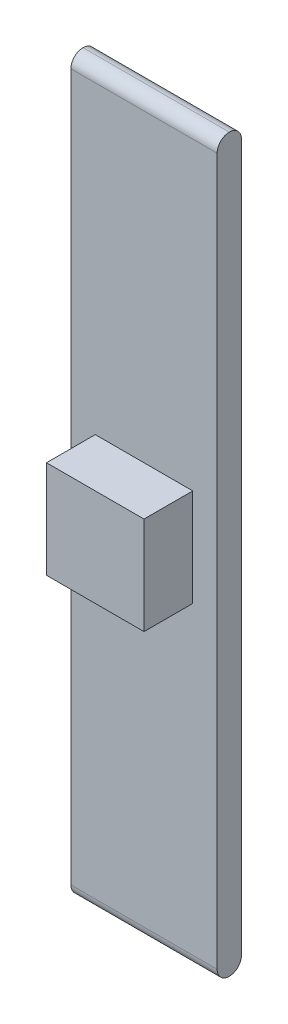
ISO-10303-21;
HEADER;
FILE_DESCRIPTION(('STEP AP214'),'2;1');
FILE_NAME('part.step','',(''),(''),'','','');
FILE_SCHEMA(('AUTOMOTIVE_DESIGN { 1 0 10303 214 1 1 1 1 }'));
ENDSEC;
DATA;
#1=APPLICATION_CONTEXT('core data for automotive mechanical design processes');
#2=APPLICATION_PROTOCOL_DEFINITION('international standard','automotive_design',2000,#1);
#3=PRODUCT_CONTEXT('',#1,'mechanical');
#4=PRODUCT('Part','Part','',(#3));
#5=PRODUCT_RELATED_PRODUCT_CATEGORY('part','',(#4));
#6=PRODUCT_DEFINITION_FORMATION('','',#4);
#7=PRODUCT_DEFINITION_CONTEXT('part definition',#1,'design');
#8=PRODUCT_DEFINITION('design','',#6,#7);
#9=PRODUCT_DEFINITION_SHAPE('','',#8);
#10=(LENGTH_UNIT() NAMED_UNIT(*) SI_UNIT(.MILLI.,.METRE.));
#11=(NAMED_UNIT(*) PLANE_ANGLE_UNIT() SI_UNIT($,.RADIAN.));
#12=(NAMED_UNIT(*) SI_UNIT($,.STERADIAN.) SOLID_ANGLE_UNIT());
#13=UNCERTAINTY_MEASURE_WITH_UNIT(LENGTH_MEASURE(1.E-05),#10,'distance_accuracy_value','');
#14=(GEOMETRIC_REPRESENTATION_CONTEXT(3) GLOBAL_UNCERTAINTY_ASSIGNED_CONTEXT((#13)) GLOBAL_UNIT_ASSIGNED_CONTEXT((#10,
#11,#12)) REPRESENTATION_CONTEXT('',''));
#15=CARTESIAN_POINT('',(0.,0.,0.));
#16=DIRECTION('',(0.,0.,1.));
#17=DIRECTION('',(1.,0.,0.));
#18=AXIS2_PLACEMENT_3D('',#15,#16,#17);
#19=CARTESIAN_POINT('',(0.,0.,0.));
#20=DIRECTION('',(0.,0.,1.));
#21=DIRECTION('',(1.,0.,0.));
#22=AXIS2_PLACEMENT_3D('',#19,#20,#21);
#23=PLANE('',#22);
#24=DIRECTION('',(0.,-1.,0.));
#25=VECTOR('',#24,1.);
#26=CARTESIAN_POINT('',(300.,1500.,0.));
#27=LINE('',#26,#25);
#28=CARTESIAN_POINT('',(300.,1450.,0.));
#29=VERTEX_POINT('',#28);
#30=CARTESIAN_POINT('',(300.,-1450.,0.));
#31=VERTEX_POINT('',#30);
#32=EDGE_CURVE('E146',#29,#31,#27,.T.);
#33=ORIENTED_EDGE('',*,*,#32,.F.);
#34=DIRECTION('',(-1.,0.,0.));
#35=VECTOR('',#34,1.);
#36=CARTESIAN_POINT('',(0.,1450.,0.));
#37=LINE('',#36,#35);
#38=CARTESIAN_POINT('',(-300.,1450.,0.));
#39=VERTEX_POINT('',#38);
#40=EDGE_CURVE('E11',#29,#39,#37,.T.);
#41=ORIENTED_EDGE('',*,*,#40,.T.);
#42=DIRECTION('',(0.,-1.,0.));
#43=VECTOR('',#42,1.);
#44=CARTESIAN_POINT('',(-300.,1500.,0.));
#45=LINE('',#44,#43);
#46=CARTESIAN_POINT('',(-300.,-1450.,0.));
#47=VERTEX_POINT('',#46);
#48=EDGE_CURVE('E150',#39,#47,#45,.T.);
#49=ORIENTED_EDGE('',*,*,#48,.T.);
#50=DIRECTION('',(-1.,0.,0.));
#51=VECTOR('',#50,1.);
#52=CARTESIAN_POINT('',(300.,-1450.,0.));
#53=LINE('',#52,#51);
#54=EDGE_CURVE('E42',#47,#31,#53,.F.);
#55=ORIENTED_EDGE('',*,*,#54,.T.);
#56=EDGE_LOOP('',(#33,#41,#49,#55));
#57=FACE_BOUND('',#56,.T.);
#58=DIRECTION('',(-1.,0.,0.));
#59=VECTOR('',#58,1.);
#60=CARTESIAN_POINT('',(-200.,200.,0.));
#61=LINE('',#60,#59);
#62=CARTESIAN_POINT('',(200.,200.,0.));
#63=VERTEX_POINT('',#62);
#64=CARTESIAN_POINT('',(-200.,200.,0.));
#65=VERTEX_POINT('',#64);
#66=EDGE_CURVE('E315',#63,#65,#61,.T.);
#67=ORIENTED_EDGE('',*,*,#66,.F.);
#68=DIRECTION('',(0.,1.,0.));
#69=VECTOR('',#68,1.);
#70=CARTESIAN_POINT('',(200.,-200.,0.));
#71=LINE('',#70,#69);
#72=CARTESIAN_POINT('',(200.,-200.,0.));
#73=VERTEX_POINT('',#72);
#74=EDGE_CURVE('E134',#73,#63,#71,.T.);
#75=ORIENTED_EDGE('',*,*,#74,.F.);
#76=DIRECTION('',(1.,0.,0.));
#77=VECTOR('',#76,1.);
#78=CARTESIAN_POINT('',(-200.,-200.,0.));
#79=LINE('',#78,#77);
#80=CARTESIAN_POINT('',(-200.,-200.,0.));
#81=VERTEX_POINT('',#80);
#82=EDGE_CURVE('E130',#81,#73,#79,.T.);
#83=ORIENTED_EDGE('',*,*,#82,.F.);
#84=DIRECTION('',(0.,-1.,0.));
#85=VECTOR('',#84,1.);
#86=CARTESIAN_POINT('',(-200.,-200.,0.));
#87=LINE('',#86,#85);
#88=EDGE_CURVE('E312',#65,#81,#87,.T.);
#89=ORIENTED_EDGE('',*,*,#88,.F.);
#90=EDGE_LOOP('',(#67,#75,#83,#89));
#91=FACE_BOUND('',#90,.T.);
#92=ADVANCED_FACE('F33',(#57,#91),#23,.T.);
#93=CARTESIAN_POINT('',(300.,1500.,-100.));
#94=DIRECTION('',(-1.,0.,0.));
#95=DIRECTION('',(0.,-1.,0.));
#96=AXIS2_PLACEMENT_3D('',#93,#94,#95);
#97=PLANE('',#96);
#98=DIRECTION('',(0.,-1.,0.));
#99=VECTOR('',#98,1.);
#100=CARTESIAN_POINT('',(300.,1500.,-100.));
#101=LINE('',#100,#99);
#102=CARTESIAN_POINT('',(300.,1450.,-100.));
#103=VERTEX_POINT('',#102);
#104=CARTESIAN_POINT('',(300.,-1450.,-100.));
#105=VERTEX_POINT('',#104);
#106=EDGE_CURVE('E145',#103,#105,#101,.T.);
#107=ORIENTED_EDGE('',*,*,#106,.F.);
#108=CARTESIAN_POINT('',(300.,1450.,-50.));
#109=DIRECTION('',(-1.,0.,0.));
#110=DIRECTION('',(0.,-1.,0.));
#111=AXIS2_PLACEMENT_3D('',#108,#109,#110);
#112=CIRCLE('',#111,50.);
#113=CARTESIAN_POINT('',(300.,1500.,-50.));
#114=VERTEX_POINT('',#113);
#115=EDGE_CURVE('E58',#103,#114,#112,.F.);
#116=ORIENTED_EDGE('',*,*,#115,.T.);
#117=CARTESIAN_POINT('',(300.,1450.,-50.));
#118=DIRECTION('',(-1.,0.,0.));
#119=DIRECTION('',(0.,-1.,0.));
#120=AXIS2_PLACEMENT_3D('',#117,#118,#119);
#121=CIRCLE('',#120,50.);
#122=EDGE_CURVE('E172',#114,#29,#121,.F.);
#123=ORIENTED_EDGE('',*,*,#122,.T.);
#124=ORIENTED_EDGE('',*,*,#32,.T.);
#125=CARTESIAN_POINT('',(300.,-1450.,-50.));
#126=DIRECTION('',(-1.,0.,0.));
#127=DIRECTION('',(0.,-1.,0.));
#128=AXIS2_PLACEMENT_3D('',#125,#126,#127);
#129=CIRCLE('',#128,50.);
#130=CARTESIAN_POINT('',(300.,-1500.,-50.));
#131=VERTEX_POINT('',#130);
#132=EDGE_CURVE('E168',#31,#131,#129,.F.);
#133=ORIENTED_EDGE('',*,*,#132,.T.);
#134=CARTESIAN_POINT('',(300.,-1450.,-50.));
#135=DIRECTION('',(-1.,0.,0.));
#136=DIRECTION('',(0.,-1.,0.));
#137=AXIS2_PLACEMENT_3D('',#134,#135,#136);
#138=CIRCLE('',#137,50.);
#139=EDGE_CURVE('E170',#131,#105,#138,.F.);
#140=ORIENTED_EDGE('',*,*,#139,.T.);
#141=EDGE_LOOP('',(#107,#116,#123,#124,#133,#140));
#142=FACE_BOUND('',#141,.T.);
#143=ADVANCED_FACE('F186',(#142),#97,.F.);
#144=CARTESIAN_POINT('',(-300.,1500.,-100.));
#145=DIRECTION('',(-1.,0.,0.));
#146=DIRECTION('',(0.,-1.,0.));
#147=AXIS2_PLACEMENT_3D('',#144,#145,#146);
#148=PLANE('',#147);
#149=CARTESIAN_POINT('',(-300.,1450.,-50.));
#150=DIRECTION('',(-1.,0.,0.));
#151=DIRECTION('',(0.,-1.,0.));
#152=AXIS2_PLACEMENT_3D('',#149,#150,#151);
#153=CIRCLE('',#152,50.);
#154=CARTESIAN_POINT('',(-300.,1500.,-50.));
#155=VERTEX_POINT('',#154);
#156=EDGE_CURVE('E158',#39,#155,#153,.T.);
#157=ORIENTED_EDGE('',*,*,#156,.T.);
#158=CARTESIAN_POINT('',(-300.,1450.,-50.));
#159=DIRECTION('',(-1.,0.,0.));
#160=DIRECTION('',(0.,-1.,0.));
#161=AXIS2_PLACEMENT_3D('',#158,#159,#160);
#162=CIRCLE('',#161,50.);
#163=CARTESIAN_POINT('',(-300.,1450.,-100.));
#164=VERTEX_POINT('',#163);
#165=EDGE_CURVE('E160',#155,#164,#162,.T.);
#166=ORIENTED_EDGE('',*,*,#165,.T.);
#167=DIRECTION('',(0.,-1.,0.));
#168=VECTOR('',#167,1.);
#169=CARTESIAN_POINT('',(-300.,1500.,-100.));
#170=LINE('',#169,#168);
#171=CARTESIAN_POINT('',(-300.,-1450.,-100.));
#172=VERTEX_POINT('',#171);
#173=EDGE_CURVE('E142',#164,#172,#170,.T.);
#174=ORIENTED_EDGE('',*,*,#173,.T.);
#175=CARTESIAN_POINT('',(-300.,-1450.,-50.));
#176=DIRECTION('',(-1.,0.,0.));
#177=DIRECTION('',(0.,-1.,0.));
#178=AXIS2_PLACEMENT_3D('',#175,#176,#177);
#179=CIRCLE('',#178,50.);
#180=CARTESIAN_POINT('',(-300.,-1500.,-50.));
#181=VERTEX_POINT('',#180);
#182=EDGE_CURVE('E156',#172,#181,#179,.T.);
#183=ORIENTED_EDGE('',*,*,#182,.T.);
#184=CARTESIAN_POINT('',(-300.,-1450.,-50.));
#185=DIRECTION('',(-1.,0.,0.));
#186=DIRECTION('',(0.,-1.,0.));
#187=AXIS2_PLACEMENT_3D('',#184,#185,#186);
#188=CIRCLE('',#187,50.);
#189=EDGE_CURVE('E149',#181,#47,#188,.T.);
#190=ORIENTED_EDGE('',*,*,#189,.T.);
#191=ORIENTED_EDGE('',*,*,#48,.F.);
#192=EDGE_LOOP('',(#157,#166,#174,#183,#190,#191));
#193=FACE_BOUND('',#192,.T.);
#194=ADVANCED_FACE('F203',(#193),#148,.T.);
#195=CARTESIAN_POINT('',(0.,0.,-100.));
#196=DIRECTION('',(0.,0.,1.));
#197=DIRECTION('',(1.,0.,0.));
#198=AXIS2_PLACEMENT_3D('',#195,#196,#197);
#199=PLANE('',#198);
#200=ORIENTED_EDGE('',*,*,#173,.F.);
#201=DIRECTION('',(-1.,0.,0.));
#202=VECTOR('',#201,1.);
#203=CARTESIAN_POINT('',(300.,1450.,-100.));
#204=LINE('',#203,#202);
#205=EDGE_CURVE('E165',#164,#103,#204,.F.);
#206=ORIENTED_EDGE('',*,*,#205,.T.);
#207=ORIENTED_EDGE('',*,*,#106,.T.);
#208=DIRECTION('',(-1.,0.,0.));
#209=VECTOR('',#208,1.);
#210=CARTESIAN_POINT('',(-5.36607795235492E-13,-1450.,-100.));
#211=LINE('',#210,#209);
#212=EDGE_CURVE('E162',#105,#172,#211,.T.);
#213=ORIENTED_EDGE('',*,*,#212,.T.);
#214=EDGE_LOOP('',(#200,#206,#207,#213));
#215=FACE_BOUND('',#214,.T.);
#216=ADVANCED_FACE('F200',(#215),#199,.F.);
#217=CARTESIAN_POINT('',(0.,1450.,-50.));
#218=DIRECTION('',(-1.,0.,0.));
#219=DIRECTION('',(0.,0.,1.));
#220=AXIS2_PLACEMENT_3D('',#217,#218,#219);
#221=CYLINDRICAL_SURFACE('',#220,50.);
#222=ORIENTED_EDGE('',*,*,#40,.F.);
#223=ORIENTED_EDGE('',*,*,#122,.F.);
#224=DIRECTION('',(-1.,0.,0.));
#225=VECTOR('',#224,1.);
#226=CARTESIAN_POINT('',(300.,1500.,-50.));
#227=LINE('',#226,#225);
#228=EDGE_CURVE('E138',#155,#114,#227,.F.);
#229=ORIENTED_EDGE('',*,*,#228,.F.);
#230=ORIENTED_EDGE('',*,*,#156,.F.);
#231=EDGE_LOOP('',(#222,#223,#229,#230));
#232=FACE_BOUND('',#231,.T.);
#233=ADVANCED_FACE('F184',(#232),#221,.T.);
#234=CARTESIAN_POINT('',(300.,1450.,-50.));
#235=DIRECTION('',(1.,0.,0.));
#236=DIRECTION('',(0.,0.,-1.));
#237=AXIS2_PLACEMENT_3D('',#234,#235,#236);
#238=CYLINDRICAL_SURFACE('',#237,50.);
#239=ORIENTED_EDGE('',*,*,#115,.F.);
#240=ORIENTED_EDGE('',*,*,#205,.F.);
#241=ORIENTED_EDGE('',*,*,#165,.F.);
#242=ORIENTED_EDGE('',*,*,#228,.T.);
#243=EDGE_LOOP('',(#239,#240,#241,#242));
#244=FACE_BOUND('',#243,.T.);
#245=ADVANCED_FACE('F179',(#244),#238,.T.);
#246=CARTESIAN_POINT('',(300.,-1450.,-50.));
#247=DIRECTION('',(1.,0.,0.));
#248=DIRECTION('',(0.,1.,0.));
#249=AXIS2_PLACEMENT_3D('',#246,#247,#248);
#250=CYLINDRICAL_SURFACE('',#249,50.);
#251=DIRECTION('',(-1.,0.,0.));
#252=VECTOR('',#251,1.);
#253=CARTESIAN_POINT('',(-300.,-1500.,-50.));
#254=LINE('',#253,#252);
#255=EDGE_CURVE('E37',#131,#181,#254,.T.);
#256=ORIENTED_EDGE('',*,*,#255,.F.);
#257=ORIENTED_EDGE('',*,*,#132,.F.);
#258=ORIENTED_EDGE('',*,*,#54,.F.);
#259=ORIENTED_EDGE('',*,*,#189,.F.);
#260=EDGE_LOOP('',(#256,#257,#258,#259));
#261=FACE_BOUND('',#260,.T.);
#262=ADVANCED_FACE('F35',(#261),#250,.T.);
#263=CARTESIAN_POINT('',(-5.36607795235492E-13,-1450.,-50.));
#264=DIRECTION('',(-1.,0.,0.));
#265=DIRECTION('',(0.,-1.,0.));
#266=AXIS2_PLACEMENT_3D('',#263,#264,#265);
#267=CYLINDRICAL_SURFACE('',#266,50.);
#268=ORIENTED_EDGE('',*,*,#139,.F.);
#269=ORIENTED_EDGE('',*,*,#255,.T.);
#270=ORIENTED_EDGE('',*,*,#182,.F.);
#271=ORIENTED_EDGE('',*,*,#212,.F.);
#272=EDGE_LOOP('',(#268,#269,#270,#271));
#273=FACE_BOUND('',#272,.T.);
#274=ADVANCED_FACE('F201',(#273),#267,.T.);
#275=CARTESIAN_POINT('',(200.,-200.,200.));
#276=DIRECTION('',(-1.,0.,0.));
#277=DIRECTION('',(0.,0.,1.));
#278=AXIS2_PLACEMENT_3D('',#275,#276,#277);
#279=PLANE('',#278);
#280=ORIENTED_EDGE('',*,*,#74,.T.);
#281=DIRECTION('',(0.,0.,-1.));
#282=VECTOR('',#281,1.);
#283=CARTESIAN_POINT('',(200.,200.,200.));
#284=LINE('',#283,#282);
#285=CARTESIAN_POINT('',(200.,200.,200.));
#286=VERTEX_POINT('',#285);
#287=EDGE_CURVE('E115',#286,#63,#284,.T.);
#288=ORIENTED_EDGE('',*,*,#287,.F.);
#289=DIRECTION('',(0.,1.,0.));
#290=VECTOR('',#289,1.);
#291=CARTESIAN_POINT('',(200.,-200.,200.));
#292=LINE('',#291,#290);
#293=CARTESIAN_POINT('',(200.,-200.,200.));
#294=VERTEX_POINT('',#293);
#295=EDGE_CURVE('E122',#294,#286,#292,.T.);
#296=ORIENTED_EDGE('',*,*,#295,.F.);
#297=DIRECTION('',(0.,0.,-1.));
#298=VECTOR('',#297,1.);
#299=CARTESIAN_POINT('',(200.,-200.,200.));
#300=LINE('',#299,#298);
#301=EDGE_CURVE('E310',#294,#73,#300,.T.);
#302=ORIENTED_EDGE('',*,*,#301,.T.);
#303=EDGE_LOOP('',(#280,#288,#296,#302));
#304=FACE_BOUND('',#303,.T.);
#305=ADVANCED_FACE('F132',(#304),#279,.F.);
#306=CARTESIAN_POINT('',(-200.,200.,200.));
#307=DIRECTION('',(0.,-1.,0.));
#308=DIRECTION('',(0.,0.,-1.));
#309=AXIS2_PLACEMENT_3D('',#306,#307,#308);
#310=PLANE('',#309);
#311=ORIENTED_EDGE('',*,*,#66,.T.);
#312=DIRECTION('',(0.,0.,-1.));
#313=VECTOR('',#312,1.);
#314=CARTESIAN_POINT('',(-200.,200.,200.));
#315=LINE('',#314,#313);
#316=CARTESIAN_POINT('',(-200.,200.,200.));
#317=VERTEX_POINT('',#316);
#318=EDGE_CURVE('E118',#317,#65,#315,.T.);
#319=ORIENTED_EDGE('',*,*,#318,.F.);
#320=DIRECTION('',(-1.,0.,0.));
#321=VECTOR('',#320,1.);
#322=CARTESIAN_POINT('',(-200.,200.,200.));
#323=LINE('',#322,#321);
#324=EDGE_CURVE('E111',#286,#317,#323,.T.);
#325=ORIENTED_EDGE('',*,*,#324,.F.);
#326=ORIENTED_EDGE('',*,*,#287,.T.);
#327=EDGE_LOOP('',(#311,#319,#325,#326));
#328=FACE_BOUND('',#327,.T.);
#329=ADVANCED_FACE('F113',(#328),#310,.F.);
#330=CARTESIAN_POINT('',(-200.,-200.,200.));
#331=DIRECTION('',(1.,0.,0.));
#332=DIRECTION('',(0.,0.,-1.));
#333=AXIS2_PLACEMENT_3D('',#330,#331,#332);
#334=PLANE('',#333);
#335=ORIENTED_EDGE('',*,*,#88,.T.);
#336=DIRECTION('',(0.,0.,-1.));
#337=VECTOR('',#336,1.);
#338=CARTESIAN_POINT('',(-200.,-200.,200.));
#339=LINE('',#338,#337);
#340=CARTESIAN_POINT('',(-200.,-200.,200.));
#341=VERTEX_POINT('',#340);
#342=EDGE_CURVE('E50',#341,#81,#339,.T.);
#343=ORIENTED_EDGE('',*,*,#342,.F.);
#344=DIRECTION('',(0.,-1.,0.));
#345=VECTOR('',#344,1.);
#346=CARTESIAN_POINT('',(-200.,-200.,200.));
#347=LINE('',#346,#345);
#348=EDGE_CURVE('E121',#317,#341,#347,.T.);
#349=ORIENTED_EDGE('',*,*,#348,.F.);
#350=ORIENTED_EDGE('',*,*,#318,.T.);
#351=EDGE_LOOP('',(#335,#343,#349,#350));
#352=FACE_BOUND('',#351,.T.);
#353=ADVANCED_FACE('F222',(#352),#334,.F.);
#354=CARTESIAN_POINT('',(-200.,-200.,200.));
#355=DIRECTION('',(0.,1.,0.));
#356=DIRECTION('',(0.,0.,1.));
#357=AXIS2_PLACEMENT_3D('',#354,#355,#356);
#358=PLANE('',#357);
#359=ORIENTED_EDGE('',*,*,#82,.T.);
#360=ORIENTED_EDGE('',*,*,#301,.F.);
#361=DIRECTION('',(1.,0.,0.));
#362=VECTOR('',#361,1.);
#363=CARTESIAN_POINT('',(-200.,-200.,200.));
#364=LINE('',#363,#362);
#365=EDGE_CURVE('E126',#341,#294,#364,.T.);
#366=ORIENTED_EDGE('',*,*,#365,.F.);
#367=ORIENTED_EDGE('',*,*,#342,.T.);
#368=EDGE_LOOP('',(#359,#360,#366,#367));
#369=FACE_BOUND('',#368,.T.);
#370=ADVANCED_FACE('F225',(#369),#358,.F.);
#371=CARTESIAN_POINT('',(0.,0.,200.));
#372=DIRECTION('',(0.,0.,-1.));
#373=DIRECTION('',(-1.,0.,0.));
#374=AXIS2_PLACEMENT_3D('',#371,#372,#373);
#375=PLANE('',#374);
#376=ORIENTED_EDGE('',*,*,#295,.T.);
#377=ORIENTED_EDGE('',*,*,#324,.T.);
#378=ORIENTED_EDGE('',*,*,#348,.T.);
#379=ORIENTED_EDGE('',*,*,#365,.T.);
#380=EDGE_LOOP('',(#376,#377,#378,#379));
#381=FACE_BOUND('',#380,.T.);
#382=ADVANCED_FACE('F125',(#381),#375,.F.);
#383=CLOSED_SHELL('',(#92,#143,#194,#216,#233,#245,#262,#274,#305,#329,#353,#370,#382));
#384=MANIFOLD_SOLID_BREP('B2',#383);
#385=ADVANCED_BREP_SHAPE_REPRESENTATION('',(#18,#384),#14);
#386=SHAPE_DEFINITION_REPRESENTATION(#9,#385);
ENDSEC;
END-ISO-10303-21;
